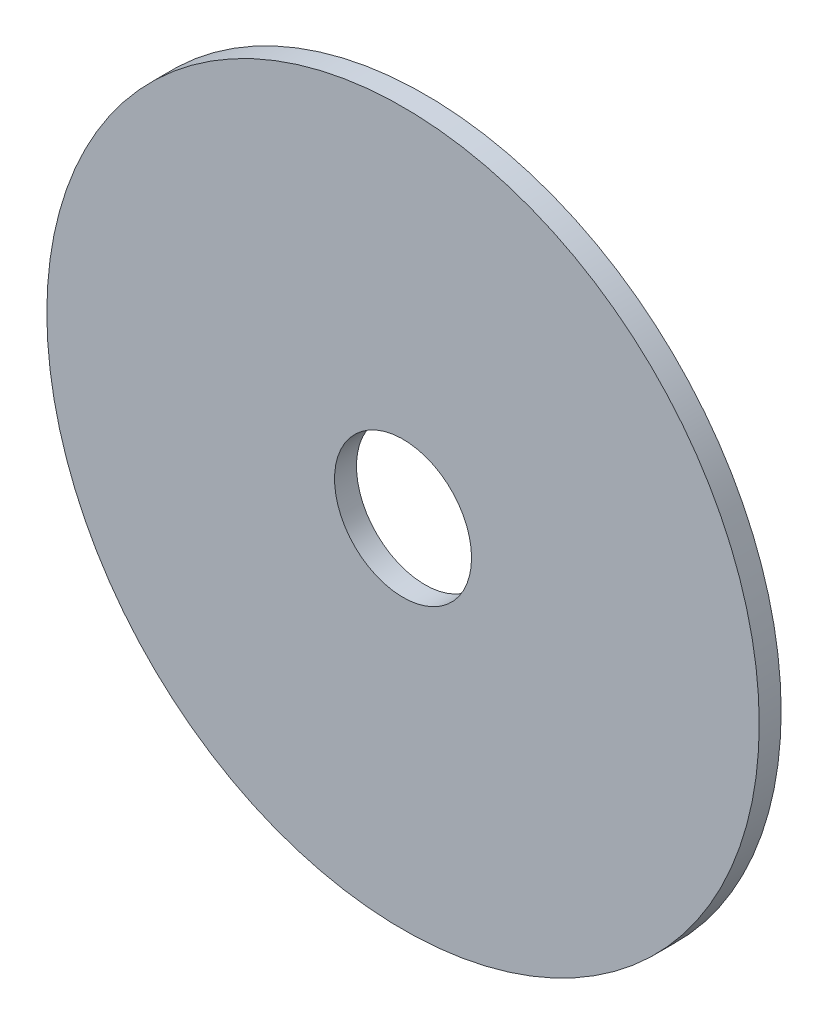
ISO-10303-21;
HEADER;
FILE_DESCRIPTION(('STEP AP214'),'2;1');
FILE_NAME('part.step','',(''),(''),'','','');
FILE_SCHEMA(('AUTOMOTIVE_DESIGN { 1 0 10303 214 1 1 1 1 }'));
ENDSEC;
DATA;
#1=APPLICATION_CONTEXT('core data for automotive mechanical design processes');
#2=APPLICATION_PROTOCOL_DEFINITION('international standard','automotive_design',2000,#1);
#3=PRODUCT_CONTEXT('',#1,'mechanical');
#4=PRODUCT('Part','Part','',(#3));
#5=PRODUCT_RELATED_PRODUCT_CATEGORY('part','',(#4));
#6=PRODUCT_DEFINITION_FORMATION('','',#4);
#7=PRODUCT_DEFINITION_CONTEXT('part definition',#1,'design');
#8=PRODUCT_DEFINITION('design','',#6,#7);
#9=PRODUCT_DEFINITION_SHAPE('','',#8);
#10=(LENGTH_UNIT() NAMED_UNIT(*) SI_UNIT(.MILLI.,.METRE.));
#11=(NAMED_UNIT(*) PLANE_ANGLE_UNIT() SI_UNIT($,.RADIAN.));
#12=(NAMED_UNIT(*) SI_UNIT($,.STERADIAN.) SOLID_ANGLE_UNIT());
#13=UNCERTAINTY_MEASURE_WITH_UNIT(LENGTH_MEASURE(1.E-05),#10,'distance_accuracy_value','');
#14=(GEOMETRIC_REPRESENTATION_CONTEXT(3) GLOBAL_UNCERTAINTY_ASSIGNED_CONTEXT((#13)) GLOBAL_UNIT_ASSIGNED_CONTEXT((#10,
#11,#12)) REPRESENTATION_CONTEXT('',''));
#15=CARTESIAN_POINT('',(0.,0.,0.));
#16=DIRECTION('',(0.,0.,1.));
#17=DIRECTION('',(1.,0.,0.));
#18=AXIS2_PLACEMENT_3D('',#15,#16,#17);
#19=CARTESIAN_POINT('',(0.,0.,2.));
#20=DIRECTION('',(0.,0.,1.));
#21=DIRECTION('',(1.,0.,0.));
#22=AXIS2_PLACEMENT_3D('',#19,#20,#21);
#23=PLANE('',#22);
#24=CARTESIAN_POINT('',(0.,0.,2.));
#25=DIRECTION('',(0.,0.,1.));
#26=DIRECTION('',(1.,0.,0.));
#27=AXIS2_PLACEMENT_3D('',#24,#25,#26);
#28=CIRCLE('',#27,32.5);
#29=CARTESIAN_POINT('',(32.5,0.,2.));
#30=VERTEX_POINT('',#29);
#31=EDGE_CURVE('E10',#30,#30,#28,.T.);
#32=ORIENTED_EDGE('',*,*,#31,.T.);
#33=EDGE_LOOP('',(#32));
#34=FACE_BOUND('',#33,.T.);
#35=CARTESIAN_POINT('',(0.,0.,2.));
#36=DIRECTION('',(0.,0.,1.));
#37=DIRECTION('',(1.,0.,0.));
#38=AXIS2_PLACEMENT_3D('',#35,#36,#37);
#39=CIRCLE('',#38,6.25);
#40=CARTESIAN_POINT('',(6.25,0.,2.));
#41=VERTEX_POINT('',#40);
#42=EDGE_CURVE('E45',#41,#41,#39,.T.);
#43=ORIENTED_EDGE('',*,*,#42,.F.);
#44=EDGE_LOOP('',(#43));
#45=FACE_BOUND('',#44,.T.);
#46=ADVANCED_FACE('F34',(#34,#45),#23,.T.);
#47=CARTESIAN_POINT('',(0.,0.,0.));
#48=DIRECTION('',(0.,0.,1.));
#49=DIRECTION('',(1.,0.,0.));
#50=AXIS2_PLACEMENT_3D('',#47,#48,#49);
#51=PLANE('',#50);
#52=CARTESIAN_POINT('',(0.,0.,0.));
#53=DIRECTION('',(0.,0.,1.));
#54=DIRECTION('',(1.,0.,0.));
#55=AXIS2_PLACEMENT_3D('',#52,#53,#54);
#56=CIRCLE('',#55,32.5);
#57=CARTESIAN_POINT('',(32.5,0.,0.));
#58=VERTEX_POINT('',#57);
#59=EDGE_CURVE('E41',#58,#58,#56,.T.);
#60=ORIENTED_EDGE('',*,*,#59,.F.);
#61=EDGE_LOOP('',(#60));
#62=FACE_BOUND('',#61,.T.);
#63=CARTESIAN_POINT('',(0.,0.,0.));
#64=DIRECTION('',(0.,0.,1.));
#65=DIRECTION('',(1.,0.,0.));
#66=AXIS2_PLACEMENT_3D('',#63,#64,#65);
#67=CIRCLE('',#66,6.25);
#68=CARTESIAN_POINT('',(6.25,0.,0.));
#69=VERTEX_POINT('',#68);
#70=EDGE_CURVE('E49',#69,#69,#67,.T.);
#71=ORIENTED_EDGE('',*,*,#70,.T.);
#72=EDGE_LOOP('',(#71));
#73=FACE_BOUND('',#72,.T.);
#74=ADVANCED_FACE('F55',(#62,#73),#51,.F.);
#75=CARTESIAN_POINT('',(0.,0.,2.));
#76=DIRECTION('',(0.,0.,-1.));
#77=DIRECTION('',(-1.,0.,0.));
#78=AXIS2_PLACEMENT_3D('',#75,#76,#77);
#79=CYLINDRICAL_SURFACE('',#78,32.5);
#80=ORIENTED_EDGE('',*,*,#31,.F.);
#81=EDGE_LOOP('',(#80));
#82=FACE_BOUND('',#81,.T.);
#83=ORIENTED_EDGE('',*,*,#59,.T.);
#84=EDGE_LOOP('',(#83));
#85=FACE_BOUND('',#84,.T.);
#86=ADVANCED_FACE('F36',(#82,#85),#79,.T.);
#87=CARTESIAN_POINT('',(0.,0.,2.));
#88=DIRECTION('',(0.,0.,-1.));
#89=DIRECTION('',(-1.,0.,0.));
#90=AXIS2_PLACEMENT_3D('',#87,#88,#89);
#91=CYLINDRICAL_SURFACE('',#90,6.25);
#92=ORIENTED_EDGE('',*,*,#42,.T.);
#93=EDGE_LOOP('',(#92));
#94=FACE_BOUND('',#93,.T.);
#95=ORIENTED_EDGE('',*,*,#70,.F.);
#96=EDGE_LOOP('',(#95));
#97=FACE_BOUND('',#96,.T.);
#98=ADVANCED_FACE('F57',(#94,#97),#91,.F.);
#99=CLOSED_SHELL('',(#46,#74,#86,#98));
#100=MANIFOLD_SOLID_BREP('B2',#99);
#101=ADVANCED_BREP_SHAPE_REPRESENTATION('',(#18,#100),#14);
#102=SHAPE_DEFINITION_REPRESENTATION(#9,#101);
ENDSEC;
END-ISO-10303-21;
